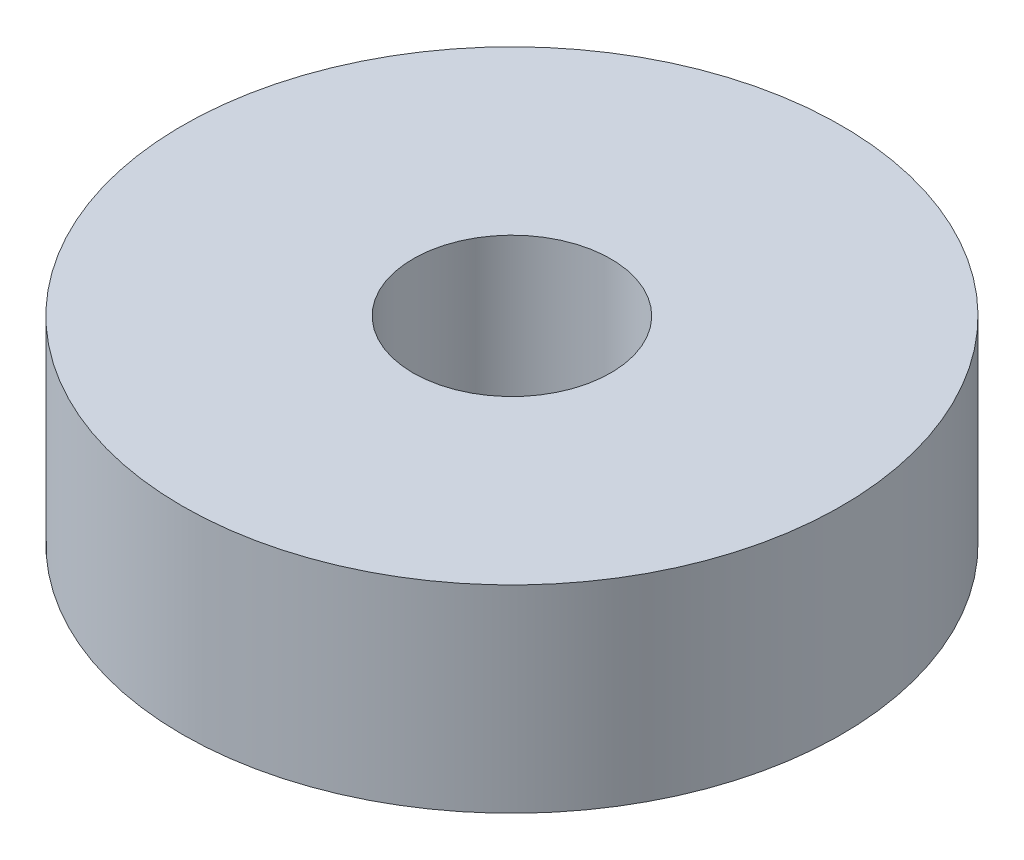
ISO-10303-21;
HEADER;
FILE_DESCRIPTION(('STEP AP214'),'2;1');
FILE_NAME('part.step','',(''),(''),'','','');
FILE_SCHEMA(('AUTOMOTIVE_DESIGN { 1 0 10303 214 1 1 1 1 }'));
ENDSEC;
DATA;
#1=APPLICATION_CONTEXT('core data for automotive mechanical design processes');
#2=APPLICATION_PROTOCOL_DEFINITION('international standard','automotive_design',2000,#1);
#3=PRODUCT_CONTEXT('',#1,'mechanical');
#4=PRODUCT('Part','Part','',(#3));
#5=PRODUCT_RELATED_PRODUCT_CATEGORY('part','',(#4));
#6=PRODUCT_DEFINITION_FORMATION('','',#4);
#7=PRODUCT_DEFINITION_CONTEXT('part definition',#1,'design');
#8=PRODUCT_DEFINITION('design','',#6,#7);
#9=PRODUCT_DEFINITION_SHAPE('','',#8);
#10=(LENGTH_UNIT() NAMED_UNIT(*) SI_UNIT(.MILLI.,.METRE.));
#11=(NAMED_UNIT(*) PLANE_ANGLE_UNIT() SI_UNIT($,.RADIAN.));
#12=(NAMED_UNIT(*) SI_UNIT($,.STERADIAN.) SOLID_ANGLE_UNIT());
#13=UNCERTAINTY_MEASURE_WITH_UNIT(LENGTH_MEASURE(1.E-05),#10,'distance_accuracy_value','');
#14=(GEOMETRIC_REPRESENTATION_CONTEXT(3) GLOBAL_UNCERTAINTY_ASSIGNED_CONTEXT((#13)) GLOBAL_UNIT_ASSIGNED_CONTEXT((#10,
#11,#12)) REPRESENTATION_CONTEXT('',''));
#15=CARTESIAN_POINT('',(0.,0.,0.));
#16=DIRECTION('',(0.,0.,1.));
#17=DIRECTION('',(1.,0.,0.));
#18=AXIS2_PLACEMENT_3D('',#15,#16,#17);
#19=CARTESIAN_POINT('',(0.,6.,0.));
#20=DIRECTION('',(0.,1.,0.));
#21=DIRECTION('',(0.,0.,1.));
#22=AXIS2_PLACEMENT_3D('',#19,#20,#21);
#23=PLANE('',#22);
#24=CARTESIAN_POINT('',(0.,6.,0.));
#25=DIRECTION('',(0.,1.,0.));
#26=DIRECTION('',(0.,0.,1.));
#27=AXIS2_PLACEMENT_3D('',#24,#25,#26);
#28=CIRCLE('',#27,10.);
#29=CARTESIAN_POINT('',(0.,6.,10.));
#30=VERTEX_POINT('',#29);
#31=EDGE_CURVE('E10',#30,#30,#28,.T.);
#32=ORIENTED_EDGE('',*,*,#31,.T.);
#33=EDGE_LOOP('',(#32));
#34=FACE_BOUND('',#33,.T.);
#35=CARTESIAN_POINT('',(0.,6.,0.));
#36=DIRECTION('',(0.,1.,0.));
#37=DIRECTION('',(0.,0.,1.));
#38=AXIS2_PLACEMENT_3D('',#35,#36,#37);
#39=CIRCLE('',#38,3.);
#40=CARTESIAN_POINT('',(0.,6.,3.));
#41=VERTEX_POINT('',#40);
#42=EDGE_CURVE('E48',#41,#41,#39,.T.);
#43=ORIENTED_EDGE('',*,*,#42,.F.);
#44=EDGE_LOOP('',(#43));
#45=FACE_BOUND('',#44,.T.);
#46=ADVANCED_FACE('F37',(#34,#45),#23,.T.);
#47=CARTESIAN_POINT('',(0.,0.,0.));
#48=DIRECTION('',(0.,1.,0.));
#49=DIRECTION('',(0.,0.,1.));
#50=AXIS2_PLACEMENT_3D('',#47,#48,#49);
#51=PLANE('',#50);
#52=CARTESIAN_POINT('',(0.,0.,0.));
#53=DIRECTION('',(0.,1.,0.));
#54=DIRECTION('',(0.,0.,1.));
#55=AXIS2_PLACEMENT_3D('',#52,#53,#54);
#56=CIRCLE('',#55,10.);
#57=CARTESIAN_POINT('',(0.,0.,10.));
#58=VERTEX_POINT('',#57);
#59=EDGE_CURVE('E41',#58,#58,#56,.T.);
#60=ORIENTED_EDGE('',*,*,#59,.F.);
#61=EDGE_LOOP('',(#60));
#62=FACE_BOUND('',#61,.T.);
#63=CARTESIAN_POINT('',(0.,0.,0.));
#64=DIRECTION('',(0.,1.,0.));
#65=DIRECTION('',(0.,0.,1.));
#66=AXIS2_PLACEMENT_3D('',#63,#64,#65);
#67=CIRCLE('',#66,3.);
#68=CARTESIAN_POINT('',(0.,0.,3.));
#69=VERTEX_POINT('',#68);
#70=EDGE_CURVE('E50',#69,#69,#67,.T.);
#71=ORIENTED_EDGE('',*,*,#70,.T.);
#72=EDGE_LOOP('',(#71));
#73=FACE_BOUND('',#72,.T.);
#74=ADVANCED_FACE('F60',(#62,#73),#51,.F.);
#75=CARTESIAN_POINT('',(0.,6.,0.));
#76=DIRECTION('',(0.,-1.,0.));
#77=DIRECTION('',(0.,0.,-1.));
#78=AXIS2_PLACEMENT_3D('',#75,#76,#77);
#79=CYLINDRICAL_SURFACE('',#78,10.);
#80=ORIENTED_EDGE('',*,*,#31,.F.);
#81=EDGE_LOOP('',(#80));
#82=FACE_BOUND('',#81,.T.);
#83=ORIENTED_EDGE('',*,*,#59,.T.);
#84=EDGE_LOOP('',(#83));
#85=FACE_BOUND('',#84,.T.);
#86=ADVANCED_FACE('F39',(#82,#85),#79,.T.);
#87=CARTESIAN_POINT('',(0.,6.,0.));
#88=DIRECTION('',(0.,-1.,0.));
#89=DIRECTION('',(0.,0.,-1.));
#90=AXIS2_PLACEMENT_3D('',#87,#88,#89);
#91=CYLINDRICAL_SURFACE('',#90,3.);
#92=ORIENTED_EDGE('',*,*,#42,.T.);
#93=EDGE_LOOP('',(#92));
#94=FACE_BOUND('',#93,.T.);
#95=ORIENTED_EDGE('',*,*,#70,.F.);
#96=EDGE_LOOP('',(#95));
#97=FACE_BOUND('',#96,.T.);
#98=ADVANCED_FACE('F56',(#94,#97),#91,.F.);
#99=CLOSED_SHELL('',(#46,#74,#86,#98));
#100=MANIFOLD_SOLID_BREP('B2',#99);
#101=ADVANCED_BREP_SHAPE_REPRESENTATION('',(#18,#100),#14);
#102=SHAPE_DEFINITION_REPRESENTATION(#9,#101);
ENDSEC;
END-ISO-10303-21;
